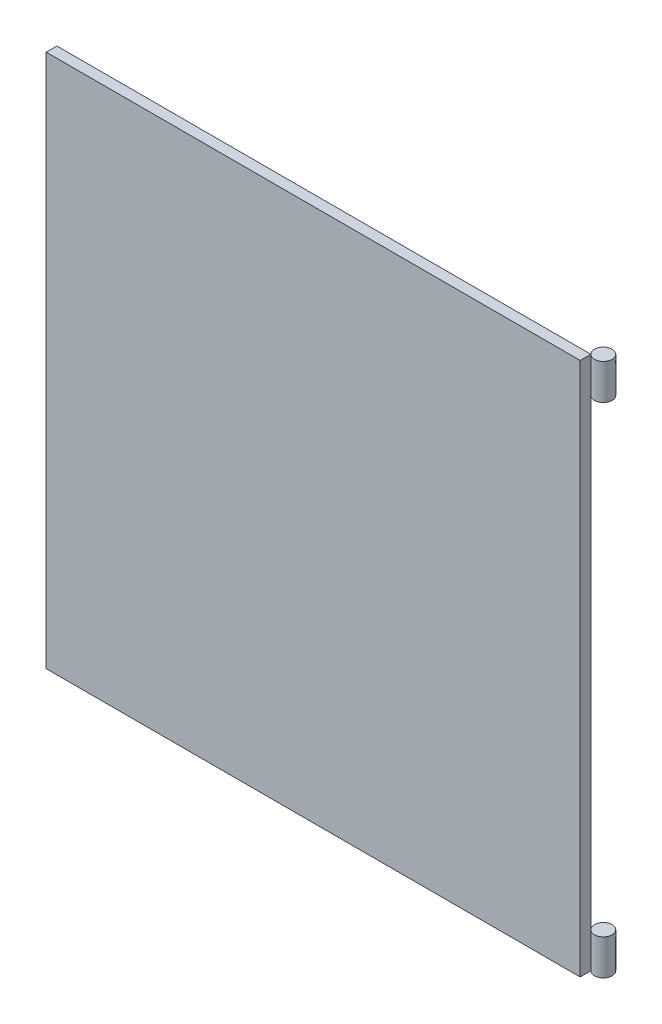
ISO-10303-21;
HEADER;
FILE_DESCRIPTION(('STEP AP214'),'2;1');
FILE_NAME('part.step','',(''),(''),'','','');
FILE_SCHEMA(('AUTOMOTIVE_DESIGN { 1 0 10303 214 1 1 1 1 }'));
ENDSEC;
DATA;
#1=APPLICATION_CONTEXT('core data for automotive mechanical design processes');
#2=APPLICATION_PROTOCOL_DEFINITION('international standard','automotive_design',2000,#1);
#3=PRODUCT_CONTEXT('',#1,'mechanical');
#4=PRODUCT('Part','Part','',(#3));
#5=PRODUCT_RELATED_PRODUCT_CATEGORY('part','',(#4));
#6=PRODUCT_DEFINITION_FORMATION('','',#4);
#7=PRODUCT_DEFINITION_CONTEXT('part definition',#1,'design');
#8=PRODUCT_DEFINITION('design','',#6,#7);
#9=PRODUCT_DEFINITION_SHAPE('','',#8);
#10=(LENGTH_UNIT() NAMED_UNIT(*) SI_UNIT(.MILLI.,.METRE.));
#11=(NAMED_UNIT(*) PLANE_ANGLE_UNIT() SI_UNIT($,.RADIAN.));
#12=(NAMED_UNIT(*) SI_UNIT($,.STERADIAN.) SOLID_ANGLE_UNIT());
#13=UNCERTAINTY_MEASURE_WITH_UNIT(LENGTH_MEASURE(1.E-05),#10,'distance_accuracy_value','');
#14=(GEOMETRIC_REPRESENTATION_CONTEXT(3) GLOBAL_UNCERTAINTY_ASSIGNED_CONTEXT((#13)) GLOBAL_UNIT_ASSIGNED_CONTEXT((#10,
#11,#12)) REPRESENTATION_CONTEXT('',''));
#15=CARTESIAN_POINT('',(0.,0.,0.));
#16=DIRECTION('',(0.,0.,1.));
#17=DIRECTION('',(1.,0.,0.));
#18=AXIS2_PLACEMENT_3D('',#15,#16,#17);
#19=CARTESIAN_POINT('',(303.5,-280.,-3.5));
#20=DIRECTION('',(0.,-1.,0.));
#21=DIRECTION('',(0.,0.,-1.));
#22=AXIS2_PLACEMENT_3D('',#19,#20,#21);
#23=CYLINDRICAL_SURFACE('',#22,4.94974746830583);
#24=CARTESIAN_POINT('',(303.5,-280.,-3.5));
#25=DIRECTION('',(0.,-1.,0.));
#26=DIRECTION('',(0.,0.,-1.));
#27=AXIS2_PLACEMENT_3D('',#24,#25,#26);
#28=CIRCLE('',#27,4.94974746830583);
#29=CARTESIAN_POINT('',(303.5,-280.,-8.44974746830583));
#30=VERTEX_POINT('',#29);
#31=EDGE_CURVE('E11',#30,#30,#28,.T.);
#32=ORIENTED_EDGE('',*,*,#31,.T.);
#33=EDGE_LOOP('',(#32));
#34=FACE_BOUND('',#33,.T.);
#35=CARTESIAN_POINT('',(303.5,-300.,-3.5));
#36=DIRECTION('',(0.,-1.,0.));
#37=DIRECTION('',(0.,0.,-1.));
#38=AXIS2_PLACEMENT_3D('',#35,#36,#37);
#39=CIRCLE('',#38,4.94974746830583);
#40=CARTESIAN_POINT('',(303.5,-300.,-8.44974746830583));
#41=VERTEX_POINT('',#40);
#42=EDGE_CURVE('E43',#41,#41,#39,.T.);
#43=ORIENTED_EDGE('',*,*,#42,.F.);
#44=EDGE_LOOP('',(#43));
#45=FACE_BOUND('',#44,.T.);
#46=ADVANCED_FACE('F40',(#34,#45),#23,.T.);
#47=CARTESIAN_POINT('',(303.5,-280.,-3.5));
#48=DIRECTION('',(0.,-1.,0.));
#49=DIRECTION('',(0.,0.,-1.));
#50=AXIS2_PLACEMENT_3D('',#47,#48,#49);
#51=PLANE('',#50);
#52=ORIENTED_EDGE('',*,*,#31,.F.);
#53=EDGE_LOOP('',(#52));
#54=FACE_BOUND('',#53,.T.);
#55=ADVANCED_FACE('F55',(#54),#51,.F.);
#56=CARTESIAN_POINT('',(303.5,-300.,-3.5));
#57=DIRECTION('',(0.,-1.,0.));
#58=DIRECTION('',(0.,0.,-1.));
#59=AXIS2_PLACEMENT_3D('',#56,#57,#58);
#60=PLANE('',#59);
#61=ORIENTED_EDGE('',*,*,#42,.T.);
#62=EDGE_LOOP('',(#61));
#63=FACE_BOUND('',#62,.T.);
#64=ADVANCED_FACE('F52',(#63),#60,.T.);
#65=CLOSED_SHELL('',(#46,#55,#64));
#66=MANIFOLD_SOLID_BREP('B2',#65);
#67=CARTESIAN_POINT('',(303.5,-20.,-3.5));
#68=DIRECTION('',(0.,1.,0.));
#69=DIRECTION('',(0.,0.,1.));
#70=AXIS2_PLACEMENT_3D('',#67,#68,#69);
#71=CYLINDRICAL_SURFACE('',#70,4.94974746830583);
#72=CARTESIAN_POINT('',(303.5,-20.,-3.5));
#73=DIRECTION('',(0.,1.,0.));
#74=DIRECTION('',(0.,0.,1.));
#75=AXIS2_PLACEMENT_3D('',#72,#73,#74);
#76=CIRCLE('',#75,4.94974746830583);
#77=CARTESIAN_POINT('',(303.5,-20.,1.44974746830583));
#78=VERTEX_POINT('',#77);
#79=EDGE_CURVE('E39',#78,#78,#76,.T.);
#80=ORIENTED_EDGE('',*,*,#79,.T.);
#81=EDGE_LOOP('',(#80));
#82=FACE_BOUND('',#81,.T.);
#83=CARTESIAN_POINT('',(303.5,0.,-3.5));
#84=DIRECTION('',(0.,1.,0.));
#85=DIRECTION('',(0.,0.,1.));
#86=AXIS2_PLACEMENT_3D('',#83,#84,#85);
#87=CIRCLE('',#86,4.94974746830583);
#88=CARTESIAN_POINT('',(303.5,0.,1.44974746830583));
#89=VERTEX_POINT('',#88);
#90=EDGE_CURVE('E93',#89,#89,#87,.T.);
#91=ORIENTED_EDGE('',*,*,#90,.F.);
#92=EDGE_LOOP('',(#91));
#93=FACE_BOUND('',#92,.T.);
#94=ADVANCED_FACE('F90',(#82,#93),#71,.T.);
#95=CARTESIAN_POINT('',(303.5,-20.,-3.5));
#96=DIRECTION('',(0.,1.,0.));
#97=DIRECTION('',(0.,0.,1.));
#98=AXIS2_PLACEMENT_3D('',#95,#96,#97);
#99=PLANE('',#98);
#100=ORIENTED_EDGE('',*,*,#79,.F.);
#101=EDGE_LOOP('',(#100));
#102=FACE_BOUND('',#101,.T.);
#103=ADVANCED_FACE('F105',(#102),#99,.F.);
#104=CARTESIAN_POINT('',(303.5,0.,-3.5));
#105=DIRECTION('',(0.,1.,0.));
#106=DIRECTION('',(0.,0.,1.));
#107=AXIS2_PLACEMENT_3D('',#104,#105,#106);
#108=PLANE('',#107);
#109=ORIENTED_EDGE('',*,*,#90,.T.);
#110=EDGE_LOOP('',(#109));
#111=FACE_BOUND('',#110,.T.);
#112=ADVANCED_FACE('F102',(#111),#108,.T.);
#113=CLOSED_SHELL('',(#94,#103,#112));
#114=MANIFOLD_SOLID_BREP('B6',#113);
#115=CARTESIAN_POINT('',(0.,0.,6.));
#116=DIRECTION('',(1.,0.,0.));
#117=DIRECTION('',(0.,1.,0.));
#118=AXIS2_PLACEMENT_3D('',#115,#116,#117);
#119=PLANE('',#118);
#120=DIRECTION('',(0.,-1.,0.));
#121=VECTOR('',#120,1.);
#122=CARTESIAN_POINT('',(0.,0.,0.));
#123=LINE('',#122,#121);
#124=CARTESIAN_POINT('',(0.,0.,0.));
#125=VERTEX_POINT('',#124);
#126=CARTESIAN_POINT('',(0.,-300.,0.));
#127=VERTEX_POINT('',#126);
#128=EDGE_CURVE('E194',#125,#127,#123,.T.);
#129=ORIENTED_EDGE('',*,*,#128,.T.);
#130=DIRECTION('',(0.,0.,-1.));
#131=VECTOR('',#130,1.);
#132=CARTESIAN_POINT('',(0.,-300.,6.));
#133=LINE('',#132,#131);
#134=CARTESIAN_POINT('',(0.,-300.,6.));
#135=VERTEX_POINT('',#134);
#136=EDGE_CURVE('E88',#135,#127,#133,.T.);
#137=ORIENTED_EDGE('',*,*,#136,.F.);
#138=DIRECTION('',(0.,-1.,0.));
#139=VECTOR('',#138,1.);
#140=CARTESIAN_POINT('',(0.,0.,6.));
#141=LINE('',#140,#139);
#142=CARTESIAN_POINT('',(0.,0.,6.));
#143=VERTEX_POINT('',#142);
#144=EDGE_CURVE('E182',#143,#135,#141,.T.);
#145=ORIENTED_EDGE('',*,*,#144,.F.);
#146=DIRECTION('',(0.,0.,-1.));
#147=VECTOR('',#146,1.);
#148=CARTESIAN_POINT('',(0.,0.,6.));
#149=LINE('',#148,#147);
#150=EDGE_CURVE('E190',#143,#125,#149,.T.);
#151=ORIENTED_EDGE('',*,*,#150,.T.);
#152=EDGE_LOOP('',(#129,#137,#145,#151));
#153=FACE_BOUND('',#152,.T.);
#154=ADVANCED_FACE('F131',(#153),#119,.F.);
#155=CARTESIAN_POINT('',(0.,-300.,6.));
#156=DIRECTION('',(0.,1.,0.));
#157=DIRECTION('',(0.,0.,1.));
#158=AXIS2_PLACEMENT_3D('',#155,#156,#157);
#159=PLANE('',#158);
#160=DIRECTION('',(1.,0.,0.));
#161=VECTOR('',#160,1.);
#162=CARTESIAN_POINT('',(0.,-300.,0.));
#163=LINE('',#162,#161);
#164=CARTESIAN_POINT('',(300.,-300.,0.));
#165=VERTEX_POINT('',#164);
#166=EDGE_CURVE('E186',#127,#165,#163,.T.);
#167=ORIENTED_EDGE('',*,*,#166,.T.);
#168=DIRECTION('',(0.,0.,-1.));
#169=VECTOR('',#168,1.);
#170=CARTESIAN_POINT('',(300.,-300.,6.));
#171=LINE('',#170,#169);
#172=CARTESIAN_POINT('',(300.,-300.,6.));
#173=VERTEX_POINT('',#172);
#174=EDGE_CURVE('E139',#173,#165,#171,.T.);
#175=ORIENTED_EDGE('',*,*,#174,.F.);
#176=DIRECTION('',(1.,0.,0.));
#177=VECTOR('',#176,1.);
#178=CARTESIAN_POINT('',(0.,-300.,6.));
#179=LINE('',#178,#177);
#180=EDGE_CURVE('E177',#135,#173,#179,.T.);
#181=ORIENTED_EDGE('',*,*,#180,.F.);
#182=ORIENTED_EDGE('',*,*,#136,.T.);
#183=EDGE_LOOP('',(#167,#175,#181,#182));
#184=FACE_BOUND('',#183,.T.);
#185=ADVANCED_FACE('F185',(#184),#159,.F.);
#186=CARTESIAN_POINT('',(300.,0.,6.));
#187=DIRECTION('',(-1.,0.,0.));
#188=DIRECTION('',(0.,-1.,0.));
#189=AXIS2_PLACEMENT_3D('',#186,#187,#188);
#190=PLANE('',#189);
#191=DIRECTION('',(0.,1.,0.));
#192=VECTOR('',#191,1.);
#193=CARTESIAN_POINT('',(300.,0.,0.));
#194=LINE('',#193,#192);
#195=CARTESIAN_POINT('',(300.,0.,0.));
#196=VERTEX_POINT('',#195);
#197=EDGE_CURVE('E164',#165,#196,#194,.T.);
#198=ORIENTED_EDGE('',*,*,#197,.T.);
#199=DIRECTION('',(0.,0.,-1.));
#200=VECTOR('',#199,1.);
#201=CARTESIAN_POINT('',(300.,0.,6.));
#202=LINE('',#201,#200);
#203=CARTESIAN_POINT('',(300.,0.,6.));
#204=VERTEX_POINT('',#203);
#205=EDGE_CURVE('E187',#204,#196,#202,.T.);
#206=ORIENTED_EDGE('',*,*,#205,.F.);
#207=DIRECTION('',(0.,1.,0.));
#208=VECTOR('',#207,1.);
#209=CARTESIAN_POINT('',(300.,0.,6.));
#210=LINE('',#209,#208);
#211=EDGE_CURVE('E180',#173,#204,#210,.T.);
#212=ORIENTED_EDGE('',*,*,#211,.F.);
#213=ORIENTED_EDGE('',*,*,#174,.T.);
#214=EDGE_LOOP('',(#198,#206,#212,#213));
#215=FACE_BOUND('',#214,.T.);
#216=ADVANCED_FACE('F188',(#215),#190,.F.);
#217=CARTESIAN_POINT('',(0.,0.,6.));
#218=DIRECTION('',(0.,-1.,0.));
#219=DIRECTION('',(0.,0.,-1.));
#220=AXIS2_PLACEMENT_3D('',#217,#218,#219);
#221=PLANE('',#220);
#222=DIRECTION('',(-1.,0.,0.));
#223=VECTOR('',#222,1.);
#224=CARTESIAN_POINT('',(0.,0.,0.));
#225=LINE('',#224,#223);
#226=EDGE_CURVE('E170',#196,#125,#225,.T.);
#227=ORIENTED_EDGE('',*,*,#226,.T.);
#228=ORIENTED_EDGE('',*,*,#150,.F.);
#229=DIRECTION('',(-1.,0.,0.));
#230=VECTOR('',#229,1.);
#231=CARTESIAN_POINT('',(0.,0.,6.));
#232=LINE('',#231,#230);
#233=EDGE_CURVE('E147',#204,#143,#232,.T.);
#234=ORIENTED_EDGE('',*,*,#233,.F.);
#235=ORIENTED_EDGE('',*,*,#205,.T.);
#236=EDGE_LOOP('',(#227,#228,#234,#235));
#237=FACE_BOUND('',#236,.T.);
#238=ADVANCED_FACE('F201',(#237),#221,.F.);
#239=CARTESIAN_POINT('',(0.,0.,6.));
#240=DIRECTION('',(0.,0.,1.));
#241=DIRECTION('',(1.,0.,0.));
#242=AXIS2_PLACEMENT_3D('',#239,#240,#241);
#243=PLANE('',#242);
#244=ORIENTED_EDGE('',*,*,#144,.T.);
#245=ORIENTED_EDGE('',*,*,#180,.T.);
#246=ORIENTED_EDGE('',*,*,#211,.T.);
#247=ORIENTED_EDGE('',*,*,#233,.T.);
#248=EDGE_LOOP('',(#244,#245,#246,#247));
#249=FACE_BOUND('',#248,.T.);
#250=ADVANCED_FACE('F178',(#249),#243,.T.);
#251=CARTESIAN_POINT('',(0.,0.,0.));
#252=DIRECTION('',(0.,0.,1.));
#253=DIRECTION('',(1.,0.,0.));
#254=AXIS2_PLACEMENT_3D('',#251,#252,#253);
#255=PLANE('',#254);
#256=ORIENTED_EDGE('',*,*,#128,.F.);
#257=ORIENTED_EDGE('',*,*,#226,.F.);
#258=ORIENTED_EDGE('',*,*,#197,.F.);
#259=ORIENTED_EDGE('',*,*,#166,.F.);
#260=EDGE_LOOP('',(#256,#257,#258,#259));
#261=FACE_BOUND('',#260,.T.);
#262=ADVANCED_FACE('F204',(#261),#255,.F.);
#263=CLOSED_SHELL('',(#154,#185,#216,#238,#250,#262));
#264=MANIFOLD_SOLID_BREP('B34',#263);
#265=ADVANCED_BREP_SHAPE_REPRESENTATION('',(#18,#66,#114,#264),#14);
#266=SHAPE_DEFINITION_REPRESENTATION(#9,#265);
ENDSEC;
END-ISO-10303-21;
